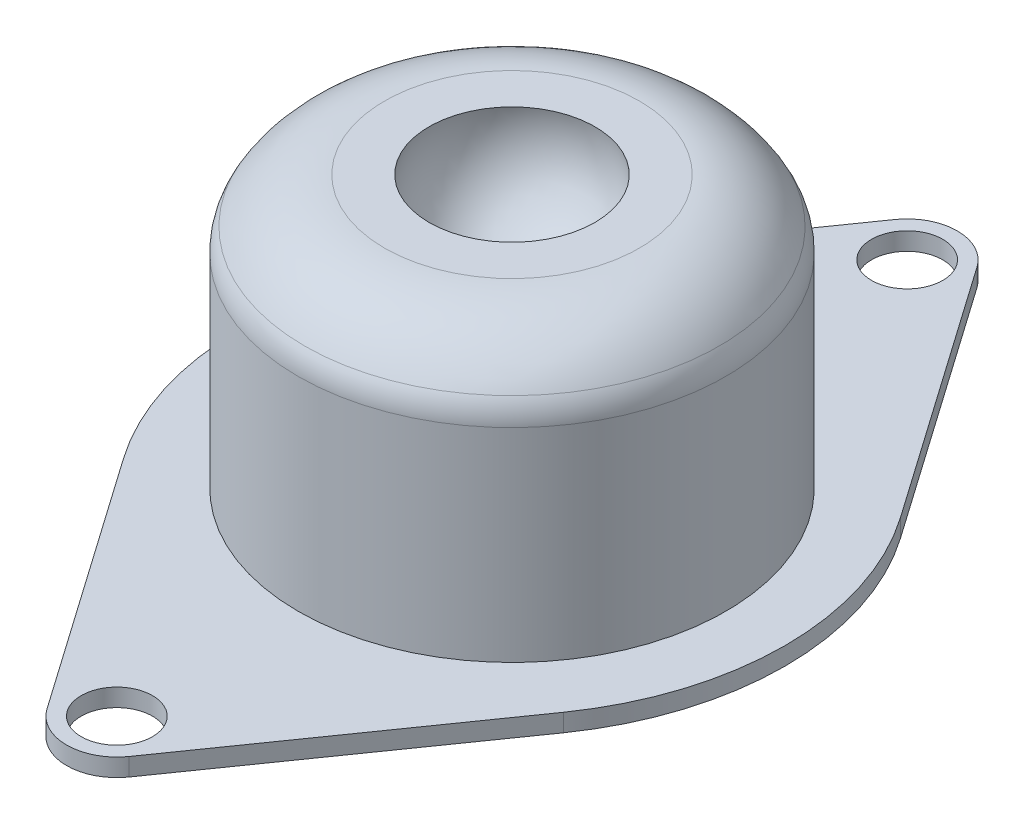
ISO-10303-21;
HEADER;
FILE_DESCRIPTION(('STEP AP214'),'2;1');
FILE_NAME('part.step','',(''),(''),'','','');
FILE_SCHEMA(('AUTOMOTIVE_DESIGN { 1 0 10303 214 1 1 1 1 }'));
ENDSEC;
DATA;
#1=APPLICATION_CONTEXT('core data for automotive mechanical design processes');
#2=APPLICATION_PROTOCOL_DEFINITION('international standard','automotive_design',2000,#1);
#3=PRODUCT_CONTEXT('',#1,'mechanical');
#4=PRODUCT('Part','Part','',(#3));
#5=PRODUCT_RELATED_PRODUCT_CATEGORY('part','',(#4));
#6=PRODUCT_DEFINITION_FORMATION('','',#4);
#7=PRODUCT_DEFINITION_CONTEXT('part definition',#1,'design');
#8=PRODUCT_DEFINITION('design','',#6,#7);
#9=PRODUCT_DEFINITION_SHAPE('','',#8);
#10=(LENGTH_UNIT() NAMED_UNIT(*) SI_UNIT(.MILLI.,.METRE.));
#11=(NAMED_UNIT(*) PLANE_ANGLE_UNIT() SI_UNIT($,.RADIAN.));
#12=(NAMED_UNIT(*) SI_UNIT($,.STERADIAN.) SOLID_ANGLE_UNIT());
#13=UNCERTAINTY_MEASURE_WITH_UNIT(LENGTH_MEASURE(1.E-05),#10,'distance_accuracy_value','');
#14=(GEOMETRIC_REPRESENTATION_CONTEXT(3) GLOBAL_UNCERTAINTY_ASSIGNED_CONTEXT((#13)) GLOBAL_UNIT_ASSIGNED_CONTEXT((#10,
#11,#12)) REPRESENTATION_CONTEXT('',''));
#15=CARTESIAN_POINT('',(0.,0.,0.));
#16=DIRECTION('',(0.,0.,1.));
#17=DIRECTION('',(1.,0.,0.));
#18=AXIS2_PLACEMENT_3D('',#15,#16,#17);
#19=CARTESIAN_POINT('',(0.,1.,-22.1839548103891));
#20=DIRECTION('',(0.,-1.,0.));
#21=DIRECTION('',(0.,0.,-1.));
#22=AXIS2_PLACEMENT_3D('',#19,#20,#21);
#23=CYLINDRICAL_SURFACE('',#22,2.81604518961093);
#24=CARTESIAN_POINT('',(0.,0.,-22.1839548103891));
#25=DIRECTION('',(0.,1.,0.));
#26=DIRECTION('',(0.,0.,-1.));
#27=AXIS2_PLACEMENT_3D('',#24,#25,#26);
#28=CIRCLE('',#27,2.81604518961093);
#29=CARTESIAN_POINT('',(2.30676917387997,0.,-23.7991719748496));
#30=VERTEX_POINT('',#29);
#31=CARTESIAN_POINT('',(-2.30676917387997,0.,-23.7991719748496));
#32=VERTEX_POINT('',#31);
#33=EDGE_CURVE('E134',#30,#32,#28,.T.);
#34=ORIENTED_EDGE('',*,*,#33,.T.);
#35=DIRECTION('',(0.,-1.,0.));
#36=VECTOR('',#35,1.);
#37=CARTESIAN_POINT('',(-2.30676917387997,1.,-23.7991719748496));
#38=LINE('',#37,#36);
#39=CARTESIAN_POINT('',(-2.30676917387997,1.,-23.7991719748496));
#40=VERTEX_POINT('',#39);
#41=EDGE_CURVE('E162',#40,#32,#38,.T.);
#42=ORIENTED_EDGE('',*,*,#41,.F.);
#43=CARTESIAN_POINT('',(0.,1.,-22.1839548103891));
#44=DIRECTION('',(0.,1.,0.));
#45=DIRECTION('',(0.,0.,-1.));
#46=AXIS2_PLACEMENT_3D('',#43,#44,#45);
#47=CIRCLE('',#46,2.81604518961093);
#48=CARTESIAN_POINT('',(2.30676917387997,1.,-23.7991719748496));
#49=VERTEX_POINT('',#48);
#50=EDGE_CURVE('E149',#49,#40,#47,.T.);
#51=ORIENTED_EDGE('',*,*,#50,.F.);
#52=DIRECTION('',(0.,-1.,0.));
#53=VECTOR('',#52,1.);
#54=CARTESIAN_POINT('',(2.30676917387997,1.,-23.7991719748496));
#55=LINE('',#54,#53);
#56=EDGE_CURVE('E130',#49,#30,#55,.T.);
#57=ORIENTED_EDGE('',*,*,#56,.T.);
#58=EDGE_LOOP('',(#34,#42,#51,#57));
#59=FACE_BOUND('',#58,.T.);
#60=ADVANCED_FACE('F36',(#59),#23,.T.);
#61=CARTESIAN_POINT('',(-2.30676917387997,1.,-23.7991719748496));
#62=DIRECTION('',(0.819152044288991,0.,0.573576436351047));
#63=DIRECTION('',(0.573576436351047,0.,-0.819152044288991));
#64=AXIS2_PLACEMENT_3D('',#61,#62,#63);
#65=PLANE('',#64);
#66=DIRECTION('',(-0.573576436351047,0.,0.819152044288991));
#67=VECTOR('',#66,1.);
#68=CARTESIAN_POINT('',(-2.30676917387997,0.,-23.7991719748496));
#69=LINE('',#68,#67);
#70=CARTESIAN_POINT('',(-12.3443568100233,0.,-9.46401119979229));
#71=VERTEX_POINT('',#70);
#72=EDGE_CURVE('E137',#32,#71,#69,.T.);
#73=ORIENTED_EDGE('',*,*,#72,.T.);
#74=DIRECTION('',(0.,-1.,0.));
#75=VECTOR('',#74,1.);
#76=CARTESIAN_POINT('',(-12.3443568100233,1.,-9.46401119979229));
#77=LINE('',#76,#75);
#78=CARTESIAN_POINT('',(-12.3443568100233,1.,-9.46401119979229));
#79=VERTEX_POINT('',#78);
#80=EDGE_CURVE('E159',#79,#71,#77,.T.);
#81=ORIENTED_EDGE('',*,*,#80,.F.);
#82=DIRECTION('',(-0.573576436351047,0.,0.819152044288991));
#83=VECTOR('',#82,1.);
#84=CARTESIAN_POINT('',(-2.30676917387997,1.,-23.7991719748496));
#85=LINE('',#84,#83);
#86=EDGE_CURVE('E97',#40,#79,#85,.T.);
#87=ORIENTED_EDGE('',*,*,#86,.F.);
#88=ORIENTED_EDGE('',*,*,#41,.T.);
#89=EDGE_LOOP('',(#73,#81,#87,#88));
#90=FACE_BOUND('',#89,.T.);
#91=ADVANCED_FACE('F215',(#90),#65,.F.);
#92=CARTESIAN_POINT('',(1.17165192074506,1.,0.));
#93=DIRECTION('',(0.,-1.,0.));
#94=DIRECTION('',(0.,0.,-1.));
#95=AXIS2_PLACEMENT_3D('',#92,#93,#94);
#96=CYLINDRICAL_SURFACE('',#95,16.5);
#97=CARTESIAN_POINT('',(1.17165192074506,0.,0.));
#98=DIRECTION('',(0.,1.,0.));
#99=DIRECTION('',(0.,0.,1.));
#100=AXIS2_PLACEMENT_3D('',#97,#98,#99);
#101=CIRCLE('',#100,16.5);
#102=CARTESIAN_POINT('',(-12.3443568100233,0.,9.46401119979227));
#103=VERTEX_POINT('',#102);
#104=EDGE_CURVE('E140',#71,#103,#101,.T.);
#105=ORIENTED_EDGE('',*,*,#104,.T.);
#106=DIRECTION('',(0.,-1.,0.));
#107=VECTOR('',#106,1.);
#108=CARTESIAN_POINT('',(-12.3443568100233,1.,9.46401119979227));
#109=LINE('',#108,#107);
#110=CARTESIAN_POINT('',(-12.3443568100233,1.,9.46401119979227));
#111=VERTEX_POINT('',#110);
#112=EDGE_CURVE('E156',#111,#103,#109,.T.);
#113=ORIENTED_EDGE('',*,*,#112,.F.);
#114=CARTESIAN_POINT('',(1.17165192074506,1.,0.));
#115=DIRECTION('',(0.,1.,0.));
#116=DIRECTION('',(0.,0.,1.));
#117=AXIS2_PLACEMENT_3D('',#114,#115,#116);
#118=CIRCLE('',#117,16.5);
#119=EDGE_CURVE('E183',#79,#111,#118,.T.);
#120=ORIENTED_EDGE('',*,*,#119,.F.);
#121=ORIENTED_EDGE('',*,*,#80,.T.);
#122=EDGE_LOOP('',(#105,#113,#120,#121));
#123=FACE_BOUND('',#122,.T.);
#124=ADVANCED_FACE('F219',(#123),#96,.T.);
#125=CARTESIAN_POINT('',(-2.30676917387997,1.,23.7991719748496));
#126=DIRECTION('',(0.819152044288991,0.,-0.573576436351047));
#127=DIRECTION('',(-0.573576436351047,0.,-0.819152044288991));
#128=AXIS2_PLACEMENT_3D('',#125,#126,#127);
#129=PLANE('',#128);
#130=DIRECTION('',(0.573576436351047,0.,0.819152044288991));
#131=VECTOR('',#130,1.);
#132=CARTESIAN_POINT('',(-2.30676917387997,0.,23.7991719748496));
#133=LINE('',#132,#131);
#134=CARTESIAN_POINT('',(-2.30676917387997,0.,23.7991719748496));
#135=VERTEX_POINT('',#134);
#136=EDGE_CURVE('E142',#103,#135,#133,.T.);
#137=ORIENTED_EDGE('',*,*,#136,.T.);
#138=DIRECTION('',(0.,-1.,0.));
#139=VECTOR('',#138,1.);
#140=CARTESIAN_POINT('',(-2.30676917387997,1.,23.7991719748496));
#141=LINE('',#140,#139);
#142=CARTESIAN_POINT('',(-2.30676917387997,1.,23.7991719748496));
#143=VERTEX_POINT('',#142);
#144=EDGE_CURVE('E153',#143,#135,#141,.T.);
#145=ORIENTED_EDGE('',*,*,#144,.F.);
#146=DIRECTION('',(0.573576436351047,0.,0.819152044288991));
#147=VECTOR('',#146,1.);
#148=CARTESIAN_POINT('',(-2.30676917387997,1.,23.7991719748496));
#149=LINE('',#148,#147);
#150=EDGE_CURVE('E185',#111,#143,#149,.T.);
#151=ORIENTED_EDGE('',*,*,#150,.F.);
#152=ORIENTED_EDGE('',*,*,#112,.T.);
#153=EDGE_LOOP('',(#137,#145,#151,#152));
#154=FACE_BOUND('',#153,.T.);
#155=ADVANCED_FACE('F191',(#154),#129,.F.);
#156=CARTESIAN_POINT('',(0.,1.,22.1839548103891));
#157=DIRECTION('',(0.,-1.,0.));
#158=DIRECTION('',(0.,0.,-1.));
#159=AXIS2_PLACEMENT_3D('',#156,#157,#158);
#160=CYLINDRICAL_SURFACE('',#159,2.81604518961093);
#161=CARTESIAN_POINT('',(0.,0.,22.1839548103891));
#162=DIRECTION('',(0.,1.,0.));
#163=DIRECTION('',(0.,0.,1.));
#164=AXIS2_PLACEMENT_3D('',#161,#162,#163);
#165=CIRCLE('',#164,2.81604518961093);
#166=CARTESIAN_POINT('',(2.30676917387997,0.,23.7991719748496));
#167=VERTEX_POINT('',#166);
#168=EDGE_CURVE('E144',#135,#167,#165,.T.);
#169=ORIENTED_EDGE('',*,*,#168,.T.);
#170=DIRECTION('',(0.,-1.,0.));
#171=VECTOR('',#170,1.);
#172=CARTESIAN_POINT('',(2.30676917387997,1.,23.7991719748496));
#173=LINE('',#172,#171);
#174=CARTESIAN_POINT('',(2.30676917387997,1.,23.7991719748496));
#175=VERTEX_POINT('',#174);
#176=EDGE_CURVE('E125',#175,#167,#173,.T.);
#177=ORIENTED_EDGE('',*,*,#176,.F.);
#178=CARTESIAN_POINT('',(0.,1.,22.1839548103891));
#179=DIRECTION('',(0.,1.,0.));
#180=DIRECTION('',(0.,0.,1.));
#181=AXIS2_PLACEMENT_3D('',#178,#179,#180);
#182=CIRCLE('',#181,2.81604518961093);
#183=EDGE_CURVE('E116',#143,#175,#182,.T.);
#184=ORIENTED_EDGE('',*,*,#183,.F.);
#185=ORIENTED_EDGE('',*,*,#144,.T.);
#186=EDGE_LOOP('',(#169,#177,#184,#185));
#187=FACE_BOUND('',#186,.T.);
#188=ADVANCED_FACE('F195',(#187),#160,.T.);
#189=CARTESIAN_POINT('',(2.30676917387998,1.,23.7991719748496));
#190=DIRECTION('',(-0.819152044288992,0.,-0.573576436351047));
#191=DIRECTION('',(-0.573576436351047,0.,0.819152044288992));
#192=AXIS2_PLACEMENT_3D('',#189,#190,#191);
#193=PLANE('',#192);
#194=DIRECTION('',(0.573576436351047,0.,-0.819152044288992));
#195=VECTOR('',#194,1.);
#196=CARTESIAN_POINT('',(2.30676917387998,0.,23.7991719748496));
#197=LINE('',#196,#195);
#198=CARTESIAN_POINT('',(12.3443568100233,0.,9.46401119979227));
#199=VERTEX_POINT('',#198);
#200=EDGE_CURVE('E124',#167,#199,#197,.T.);
#201=ORIENTED_EDGE('',*,*,#200,.T.);
#202=DIRECTION('',(0.,-1.,0.));
#203=VECTOR('',#202,1.);
#204=CARTESIAN_POINT('',(12.3443568100233,1.,9.46401119979227));
#205=LINE('',#204,#203);
#206=CARTESIAN_POINT('',(12.3443568100233,1.,9.46401119979227));
#207=VERTEX_POINT('',#206);
#208=EDGE_CURVE('E121',#207,#199,#205,.T.);
#209=ORIENTED_EDGE('',*,*,#208,.F.);
#210=DIRECTION('',(0.573576436351047,0.,-0.819152044288992));
#211=VECTOR('',#210,1.);
#212=CARTESIAN_POINT('',(2.30676917387998,1.,23.7991719748496));
#213=LINE('',#212,#211);
#214=EDGE_CURVE('E110',#175,#207,#213,.T.);
#215=ORIENTED_EDGE('',*,*,#214,.F.);
#216=ORIENTED_EDGE('',*,*,#176,.T.);
#217=EDGE_LOOP('',(#201,#209,#215,#216));
#218=FACE_BOUND('',#217,.T.);
#219=ADVANCED_FACE('F122',(#218),#193,.F.);
#220=CARTESIAN_POINT('',(-1.17165192074505,1.,0.));
#221=DIRECTION('',(0.,-1.,0.));
#222=DIRECTION('',(0.,0.,-1.));
#223=AXIS2_PLACEMENT_3D('',#220,#221,#222);
#224=CYLINDRICAL_SURFACE('',#223,16.5);
#225=CARTESIAN_POINT('',(-1.17165192074505,0.,0.));
#226=DIRECTION('',(0.,1.,0.));
#227=DIRECTION('',(0.,0.,-1.));
#228=AXIS2_PLACEMENT_3D('',#225,#226,#227);
#229=CIRCLE('',#228,16.5);
#230=CARTESIAN_POINT('',(12.3443568100233,0.,-9.46401119979229));
#231=VERTEX_POINT('',#230);
#232=EDGE_CURVE('E82',#199,#231,#229,.T.);
#233=ORIENTED_EDGE('',*,*,#232,.T.);
#234=DIRECTION('',(0.,-1.,0.));
#235=VECTOR('',#234,1.);
#236=CARTESIAN_POINT('',(12.3443568100233,1.,-9.46401119979229));
#237=LINE('',#236,#235);
#238=CARTESIAN_POINT('',(12.3443568100233,1.,-9.46401119979229));
#239=VERTEX_POINT('',#238);
#240=EDGE_CURVE('E126',#239,#231,#237,.T.);
#241=ORIENTED_EDGE('',*,*,#240,.F.);
#242=CARTESIAN_POINT('',(-1.17165192074505,1.,0.));
#243=DIRECTION('',(0.,1.,0.));
#244=DIRECTION('',(0.,0.,-1.));
#245=AXIS2_PLACEMENT_3D('',#242,#243,#244);
#246=CIRCLE('',#245,16.5);
#247=EDGE_CURVE('E114',#207,#239,#246,.T.);
#248=ORIENTED_EDGE('',*,*,#247,.F.);
#249=ORIENTED_EDGE('',*,*,#208,.T.);
#250=EDGE_LOOP('',(#233,#241,#248,#249));
#251=FACE_BOUND('',#250,.T.);
#252=ADVANCED_FACE('F128',(#251),#224,.T.);
#253=CARTESIAN_POINT('',(2.30676917387997,1.,-23.7991719748496));
#254=DIRECTION('',(-0.819152044288991,0.,0.573576436351047));
#255=DIRECTION('',(0.573576436351047,0.,0.819152044288991));
#256=AXIS2_PLACEMENT_3D('',#253,#254,#255);
#257=PLANE('',#256);
#258=DIRECTION('',(-0.573576436351047,0.,-0.819152044288991));
#259=VECTOR('',#258,1.);
#260=CARTESIAN_POINT('',(2.30676917387997,0.,-23.7991719748496));
#261=LINE('',#260,#259);
#262=EDGE_CURVE('E88',#231,#30,#261,.T.);
#263=ORIENTED_EDGE('',*,*,#262,.T.);
#264=ORIENTED_EDGE('',*,*,#56,.F.);
#265=DIRECTION('',(-0.573576436351047,0.,-0.819152044288991));
#266=VECTOR('',#265,1.);
#267=CARTESIAN_POINT('',(2.30676917387997,1.,-23.7991719748496));
#268=LINE('',#267,#266);
#269=EDGE_CURVE('E53',#239,#49,#268,.T.);
#270=ORIENTED_EDGE('',*,*,#269,.F.);
#271=ORIENTED_EDGE('',*,*,#240,.T.);
#272=EDGE_LOOP('',(#263,#264,#270,#271));
#273=FACE_BOUND('',#272,.T.);
#274=ADVANCED_FACE('F203',(#273),#257,.F.);
#275=CARTESIAN_POINT('',(0.,1.,-22.1839548103891));
#276=DIRECTION('',(0.,-1.,0.));
#277=DIRECTION('',(0.,0.,-1.));
#278=AXIS2_PLACEMENT_3D('',#275,#276,#277);
#279=PLANE('',#278);
#280=CARTESIAN_POINT('',(0.,1.,22.1839548103891));
#281=DIRECTION('',(0.,1.,0.));
#282=DIRECTION('',(0.,0.,1.));
#283=AXIS2_PLACEMENT_3D('',#280,#281,#282);
#284=CIRCLE('',#283,2.);
#285=CARTESIAN_POINT('',(0.,1.,24.1839548103891));
#286=VERTEX_POINT('',#285);
#287=EDGE_CURVE('E332',#286,#286,#284,.T.);
#288=ORIENTED_EDGE('',*,*,#287,.F.);
#289=EDGE_LOOP('',(#288));
#290=FACE_BOUND('',#289,.T.);
#291=CARTESIAN_POINT('',(0.,1.,-22.1839548103891));
#292=DIRECTION('',(0.,1.,0.));
#293=DIRECTION('',(0.,0.,1.));
#294=AXIS2_PLACEMENT_3D('',#291,#292,#293);
#295=CIRCLE('',#294,2.);
#296=CARTESIAN_POINT('',(0.,1.,-20.1839548103891));
#297=VERTEX_POINT('',#296);
#298=EDGE_CURVE('E173',#297,#297,#295,.T.);
#299=ORIENTED_EDGE('',*,*,#298,.F.);
#300=EDGE_LOOP('',(#299));
#301=FACE_BOUND('',#300,.T.);
#302=CARTESIAN_POINT('',(0.,1.,0.));
#303=DIRECTION('',(0.,1.,0.));
#304=DIRECTION('',(0.,0.,1.));
#305=AXIS2_PLACEMENT_3D('',#302,#303,#304);
#306=CIRCLE('',#305,12.);
#307=CARTESIAN_POINT('',(0.,1.,12.));
#308=VERTEX_POINT('',#307);
#309=EDGE_CURVE('E163',#308,#308,#306,.T.);
#310=ORIENTED_EDGE('',*,*,#309,.F.);
#311=EDGE_LOOP('',(#310));
#312=FACE_BOUND('',#311,.T.);
#313=ORIENTED_EDGE('',*,*,#50,.T.);
#314=ORIENTED_EDGE('',*,*,#86,.T.);
#315=ORIENTED_EDGE('',*,*,#119,.T.);
#316=ORIENTED_EDGE('',*,*,#150,.T.);
#317=ORIENTED_EDGE('',*,*,#183,.T.);
#318=ORIENTED_EDGE('',*,*,#214,.T.);
#319=ORIENTED_EDGE('',*,*,#247,.T.);
#320=ORIENTED_EDGE('',*,*,#269,.T.);
#321=EDGE_LOOP('',(#313,#314,#315,#316,#317,#318,#319,#320));
#322=FACE_BOUND('',#321,.T.);
#323=ADVANCED_FACE('F112',(#290,#301,#312,#322),#279,.F.);
#324=CARTESIAN_POINT('',(0.,0.,-22.1839548103891));
#325=DIRECTION('',(0.,-1.,0.));
#326=DIRECTION('',(0.,0.,-1.));
#327=AXIS2_PLACEMENT_3D('',#324,#325,#326);
#328=PLANE('',#327);
#329=CARTESIAN_POINT('',(0.,0.,22.1839548103891));
#330=DIRECTION('',(0.,1.,0.));
#331=DIRECTION('',(0.,0.,1.));
#332=AXIS2_PLACEMENT_3D('',#329,#330,#331);
#333=CIRCLE('',#332,2.);
#334=CARTESIAN_POINT('',(0.,0.,24.1839548103891));
#335=VERTEX_POINT('',#334);
#336=EDGE_CURVE('E178',#335,#335,#333,.T.);
#337=ORIENTED_EDGE('',*,*,#336,.T.);
#338=EDGE_LOOP('',(#337));
#339=FACE_BOUND('',#338,.T.);
#340=CARTESIAN_POINT('',(0.,0.,-22.1839548103891));
#341=DIRECTION('',(0.,1.,0.));
#342=DIRECTION('',(0.,0.,1.));
#343=AXIS2_PLACEMENT_3D('',#340,#341,#342);
#344=CIRCLE('',#343,2.);
#345=CARTESIAN_POINT('',(0.,0.,-20.1839548103891));
#346=VERTEX_POINT('',#345);
#347=EDGE_CURVE('E333',#346,#346,#344,.T.);
#348=ORIENTED_EDGE('',*,*,#347,.T.);
#349=EDGE_LOOP('',(#348));
#350=FACE_BOUND('',#349,.T.);
#351=ORIENTED_EDGE('',*,*,#33,.F.);
#352=ORIENTED_EDGE('',*,*,#262,.F.);
#353=ORIENTED_EDGE('',*,*,#232,.F.);
#354=ORIENTED_EDGE('',*,*,#200,.F.);
#355=ORIENTED_EDGE('',*,*,#168,.F.);
#356=ORIENTED_EDGE('',*,*,#136,.F.);
#357=ORIENTED_EDGE('',*,*,#104,.F.);
#358=ORIENTED_EDGE('',*,*,#72,.F.);
#359=EDGE_LOOP('',(#351,#352,#353,#354,#355,#356,#357,#358));
#360=FACE_BOUND('',#359,.T.);
#361=ADVANCED_FACE('F198',(#339,#350,#360),#328,.T.);
#362=CARTESIAN_POINT('',(0.,15.2375,0.));
#363=DIRECTION('',(0.,1.,0.));
#364=DIRECTION('',(1.,0.,0.));
#365=AXIS2_PLACEMENT_3D('',#362,#363,#364);
#366=SPHERICAL_SURFACE('',#365,4.7625);
#367=CARTESIAN_POINT('',(0.,16.2375,0.));
#368=DIRECTION('',(0.,1.,0.));
#369=DIRECTION('',(0.,0.,1.));
#370=AXIS2_PLACEMENT_3D('',#367,#368,#369);
#371=CIRCLE('',#370,4.65632969730452);
#372=CARTESIAN_POINT('',(0.,16.2375,4.65632969730452));
#373=VERTEX_POINT('',#372);
#374=EDGE_CURVE('E138',#373,#373,#371,.T.);
#375=ORIENTED_EDGE('',*,*,#374,.T.);
#376=EDGE_LOOP('',(#375));
#377=FACE_BOUND('',#376,.T.);
#378=ADVANCED_FACE('F248',(#377),#366,.F.);
#379=CARTESIAN_POINT('',(7.15632969730452,16.2375,0.));
#380=DIRECTION('',(0.,-1.,0.));
#381=DIRECTION('',(0.,0.,-1.));
#382=AXIS2_PLACEMENT_3D('',#379,#380,#381);
#383=PLANE('',#382);
#384=ORIENTED_EDGE('',*,*,#374,.F.);
#385=EDGE_LOOP('',(#384));
#386=FACE_BOUND('',#385,.T.);
#387=CARTESIAN_POINT('',(0.,16.2375,0.));
#388=DIRECTION('',(0.,1.,0.));
#389=DIRECTION('',(0.,0.,1.));
#390=AXIS2_PLACEMENT_3D('',#387,#388,#389);
#391=CIRCLE('',#390,7.15632969730452);
#392=CARTESIAN_POINT('',(0.,16.2375,7.15632969730452));
#393=VERTEX_POINT('',#392);
#394=EDGE_CURVE('E175',#393,#393,#391,.T.);
#395=ORIENTED_EDGE('',*,*,#394,.T.);
#396=EDGE_LOOP('',(#395));
#397=FACE_BOUND('',#396,.T.);
#398=ADVANCED_FACE('F253',(#386,#397),#383,.F.);
#399=CARTESIAN_POINT('',(0.,10.9954076059901,0.));
#400=DIRECTION('',(0.,1.,0.));
#401=DIRECTION('',(0.,0.,1.));
#402=AXIS2_PLACEMENT_3D('',#399,#400,#401);
#403=TOROIDAL_SURFACE('',#402,7.15632969730452,5.2420923940099);
#404=CARTESIAN_POINT('',(0.,13.7166820211627,0.));
#405=DIRECTION('',(0.,-1.,0.));
#406=DIRECTION('',(0.,0.,-1.));
#407=AXIS2_PLACEMENT_3D('',#404,#405,#406);
#408=CIRCLE('',#407,11.6367535862534);
#409=CARTESIAN_POINT('',(0.,13.7166820211627,-11.6367535862534));
#410=VERTEX_POINT('',#409);
#411=EDGE_CURVE('E45',#410,#410,#408,.F.);
#412=ORIENTED_EDGE('',*,*,#411,.T.);
#413=EDGE_LOOP('',(#412));
#414=FACE_BOUND('',#413,.T.);
#415=ORIENTED_EDGE('',*,*,#394,.F.);
#416=EDGE_LOOP('',(#415));
#417=FACE_BOUND('',#416,.T.);
#418=ADVANCED_FACE('F265',(#414,#417),#403,.T.);
#419=CARTESIAN_POINT('',(0.,10.475,0.));
#420=DIRECTION('',(0.,1.,0.));
#421=DIRECTION('',(0.,0.,1.));
#422=AXIS2_PLACEMENT_3D('',#419,#420,#421);
#423=CYLINDRICAL_SURFACE('',#422,12.);
#424=CARTESIAN_POINT('',(0.,12.4188823017786,0.));
#425=DIRECTION('',(0.,-1.,0.));
#426=DIRECTION('',(0.,0.,-1.));
#427=AXIS2_PLACEMENT_3D('',#424,#425,#426);
#428=CIRCLE('',#427,12.);
#429=CARTESIAN_POINT('',(0.,12.4188823017786,-12.));
#430=VERTEX_POINT('',#429);
#431=EDGE_CURVE('E11',#430,#430,#428,.T.);
#432=ORIENTED_EDGE('',*,*,#431,.T.);
#433=EDGE_LOOP('',(#432));
#434=FACE_BOUND('',#433,.T.);
#435=ORIENTED_EDGE('',*,*,#309,.T.);
#436=EDGE_LOOP('',(#435));
#437=FACE_BOUND('',#436,.T.);
#438=ADVANCED_FACE('F275',(#434,#437),#423,.T.);
#439=CARTESIAN_POINT('',(0.,12.4188823017786,0.));
#440=DIRECTION('',(0.,-1.,0.));
#441=DIRECTION('',(0.,0.,-1.));
#442=AXIS2_PLACEMENT_3D('',#439,#440,#441);
#443=TOROIDAL_SURFACE('',#442,9.5,2.5);
#444=ORIENTED_EDGE('',*,*,#431,.F.);
#445=EDGE_LOOP('',(#444));
#446=FACE_BOUND('',#445,.T.);
#447=ORIENTED_EDGE('',*,*,#411,.F.);
#448=EDGE_LOOP('',(#447));
#449=FACE_BOUND('',#448,.T.);
#450=ADVANCED_FACE('F38',(#446,#449),#443,.T.);
#451=CARTESIAN_POINT('',(0.,0.,-22.1839548103891));
#452=DIRECTION('',(0.,1.,0.));
#453=DIRECTION('',(0.,0.,1.));
#454=AXIS2_PLACEMENT_3D('',#451,#452,#453);
#455=CYLINDRICAL_SURFACE('',#454,2.);
#456=ORIENTED_EDGE('',*,*,#347,.F.);
#457=EDGE_LOOP('',(#456));
#458=FACE_BOUND('',#457,.T.);
#459=ORIENTED_EDGE('',*,*,#298,.T.);
#460=EDGE_LOOP('',(#459));
#461=FACE_BOUND('',#460,.T.);
#462=ADVANCED_FACE('F293',(#458,#461),#455,.F.);
#463=CARTESIAN_POINT('',(0.,0.,22.1839548103891));
#464=DIRECTION('',(0.,1.,0.));
#465=DIRECTION('',(0.,0.,1.));
#466=AXIS2_PLACEMENT_3D('',#463,#464,#465);
#467=CYLINDRICAL_SURFACE('',#466,2.);
#468=ORIENTED_EDGE('',*,*,#336,.F.);
#469=EDGE_LOOP('',(#468));
#470=FACE_BOUND('',#469,.T.);
#471=ORIENTED_EDGE('',*,*,#287,.T.);
#472=EDGE_LOOP('',(#471));
#473=FACE_BOUND('',#472,.T.);
#474=ADVANCED_FACE('F313',(#470,#473),#467,.F.);
#475=CLOSED_SHELL('',(#60,#91,#124,#155,#188,#219,#252,#274,#323,#361,#378,#398,#418,#438,#450,
#462,#474));
#476=MANIFOLD_SOLID_BREP('B2',#475);
#477=ADVANCED_BREP_SHAPE_REPRESENTATION('',(#18,#476),#14);
#478=SHAPE_DEFINITION_REPRESENTATION(#9,#477);
ENDSEC;
END-ISO-10303-21;
